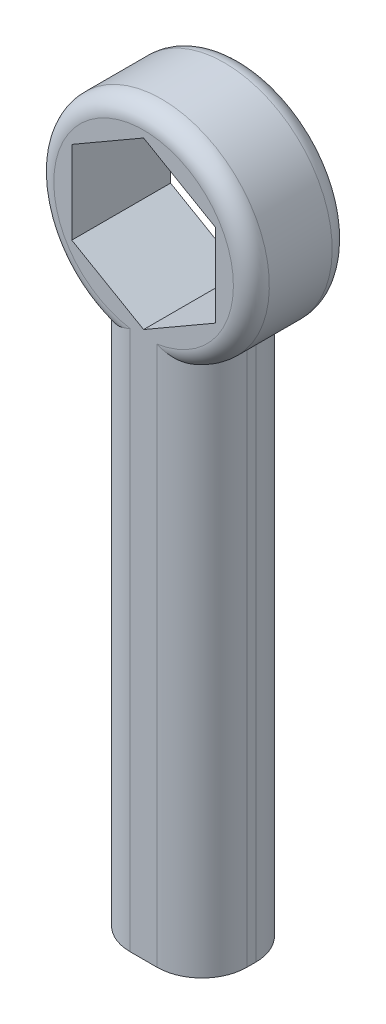
ISO-10303-21;
HEADER;
FILE_DESCRIPTION(('STEP AP214'),'2;1');
FILE_NAME('part.step','',(''),(''),'','','');
FILE_SCHEMA(('AUTOMOTIVE_DESIGN { 1 0 10303 214 1 1 1 1 }'));
ENDSEC;
DATA;
#1=APPLICATION_CONTEXT('core data for automotive mechanical design processes');
#2=APPLICATION_PROTOCOL_DEFINITION('international standard','automotive_design',2000,#1);
#3=PRODUCT_CONTEXT('',#1,'mechanical');
#4=PRODUCT('Part','Part','',(#3));
#5=PRODUCT_RELATED_PRODUCT_CATEGORY('part','',(#4));
#6=PRODUCT_DEFINITION_FORMATION('','',#4);
#7=PRODUCT_DEFINITION_CONTEXT('part definition',#1,'design');
#8=PRODUCT_DEFINITION('design','',#6,#7);
#9=PRODUCT_DEFINITION_SHAPE('','',#8);
#10=(LENGTH_UNIT() NAMED_UNIT(*) SI_UNIT(.MILLI.,.METRE.));
#11=(NAMED_UNIT(*) PLANE_ANGLE_UNIT() SI_UNIT($,.RADIAN.));
#12=(NAMED_UNIT(*) SI_UNIT($,.STERADIAN.) SOLID_ANGLE_UNIT());
#13=UNCERTAINTY_MEASURE_WITH_UNIT(LENGTH_MEASURE(1.E-05),#10,'distance_accuracy_value','');
#14=(GEOMETRIC_REPRESENTATION_CONTEXT(3) GLOBAL_UNCERTAINTY_ASSIGNED_CONTEXT((#13)) GLOBAL_UNIT_ASSIGNED_CONTEXT((#10,
#11,#12)) REPRESENTATION_CONTEXT('',''));
#15=CARTESIAN_POINT('',(0.,0.,0.));
#16=DIRECTION('',(0.,0.,1.));
#17=DIRECTION('',(1.,0.,0.));
#18=AXIS2_PLACEMENT_3D('',#15,#16,#17);
#19=CARTESIAN_POINT('',(1.5,70.,-0.500000000000002));
#20=DIRECTION('',(0.,-1.,0.));
#21=DIRECTION('',(0.,0.,-1.));
#22=AXIS2_PLACEMENT_3D('',#19,#20,#21);
#23=CYLINDRICAL_SURFACE('',#22,5.);
#24=DIRECTION('',(0.,-1.,0.));
#25=VECTOR('',#24,1.);
#26=CARTESIAN_POINT('',(1.49999999999996,70.,-5.5));
#27=LINE('',#26,#25);
#28=CARTESIAN_POINT('',(1.49999999999996,60.1131400333574,-5.5));
#29=VERTEX_POINT('',#28);
#30=CARTESIAN_POINT('',(1.49999999999996,0.,-5.5));
#31=VERTEX_POINT('',#30);
#32=EDGE_CURVE('E377',#29,#31,#27,.T.);
#33=ORIENTED_EDGE('',*,*,#32,.F.);
#34=CARTESIAN_POINT('',(5.49999999999999,59.3346354961492,-3.5));
#35=CARTESIAN_POINT('',(5.45124143479287,59.3094776292966,-3.56503879454095));
#36=CARTESIAN_POINT('',(5.40034241967062,59.2872350126028,-3.62957380392987));
#37=CARTESIAN_POINT('',(5.29457365874422,59.2483664907826,-3.75699543171036));
#38=CARTESIAN_POINT('',(5.23970635725963,59.2317371632558,-3.81988303286578));
#39=CARTESIAN_POINT('',(5.12652343234616,59.2039182242144,-3.94315317655292));
#40=CARTESIAN_POINT('',(5.06822563834152,59.1927028674889,-4.00354630081369));
#41=CARTESIAN_POINT('',(4.94828264473742,59.1753177176033,-4.12166327627799));
#42=CARTESIAN_POINT('',(4.88663693548613,59.1691486949536,-4.17938671858645));
#43=CARTESIAN_POINT('',(4.69167729612288,59.157454647773,-4.35281829027385));
#44=CARTESIAN_POINT('',(4.55322289605756,59.1599016821991,-4.46343359744472));
#45=CARTESIAN_POINT('',(4.26634261393346,59.182711082341,-4.66876521816472));
#46=CARTESIAN_POINT('',(4.11790440031765,59.2030959938528,-4.76346134472014));
#47=CARTESIAN_POINT('',(3.79229541953926,59.2630564875119,-4.94805722214688));
#48=CARTESIAN_POINT('',(3.61405943604584,59.3049673398718,-5.03531585700614));
#49=CARTESIAN_POINT('',(3.25242926067639,59.4049188301471,-5.18695421767217));
#50=CARTESIAN_POINT('',(3.06903021046214,59.462975149827,-5.25131156068039));
#51=CARTESIAN_POINT('',(2.65576398156407,59.6075889661406,-5.37041609541042));
#52=CARTESIAN_POINT('',(2.42537772622433,59.6976435938048,-5.41908246909473));
#53=CARTESIAN_POINT('',(1.96665779195046,59.892407337434,-5.48355541974921));
#54=CARTESIAN_POINT('',(1.73832180113136,59.9970969122397,-5.499405375479));
#55=CARTESIAN_POINT('',(1.50854314969362,60.1089734957554,-5.49999453062573));
#56=CARTESIAN_POINT('',(1.5042710600282,60.1110558554849,-5.5000000033685));
#57=CARTESIAN_POINT('',(1.5,60.1131400333574,-5.5));
#58=B_SPLINE_CURVE_WITH_KNOTS('',3,(#34,#35,#36,#37,#38,#39,#40,#41,#42,#43,#44,#45,#46,#47,#48,
#49,#50,#51,#52,#53,#54,#55,#56,#57),.UNSPECIFIED.,.F.,.F.,(4,2,2,2,2,2,2,2,2,2,2,4),(0.,
0.255162935083431,0.510170016139327,0.763952207698074,1.01777314130476,1.54718859164722,
2.07727040673703,2.6834658634995,3.29025217441575,4.0436742960229,4.79609986043402,
4.81035757711839),.UNSPECIFIED.);
#59=CARTESIAN_POINT('',(5.49999999999999,59.3346354961492,-3.50000000000001));
#60=VERTEX_POINT('',#59);
#61=EDGE_CURVE('E294',#29,#60,#58,.F.);
#62=ORIENTED_EDGE('',*,*,#61,.T.);
#63=CARTESIAN_POINT('',(1.49999999999996,58.0941191002093,-5.5));
#64=CARTESIAN_POINT('',(1.63913954709118,58.1116260933152,-5.50001884113127));
#65=CARTESIAN_POINT('',(1.77793920735278,58.1316132418032,-5.49419290614323));
#66=CARTESIAN_POINT('',(2.05376525015465,58.1762352917903,-5.47116046217421));
#67=CARTESIAN_POINT('',(2.19079252491806,58.2008677491185,-5.45395992616529));
#68=CARTESIAN_POINT('',(2.46152091437614,58.254366807787,-5.4085884561147));
#69=CARTESIAN_POINT('',(2.59523417605695,58.2832139543095,-5.38046699337544));
#70=CARTESIAN_POINT('',(2.85906135295005,58.3447801349958,-5.31367729382303));
#71=CARTESIAN_POINT('',(2.98917488351717,58.3774995809732,-5.27500793468384));
#72=CARTESIAN_POINT('',(3.37243998309789,58.4806119696976,-5.14399131991311));
#73=CARTESIAN_POINT('',(3.61923014235078,58.556103310103,-5.03651281410748));
#74=CARTESIAN_POINT('',(4.0904032120329,58.7159061465054,-4.785015064546));
#75=CARTESIAN_POINT('',(4.31475888741042,58.8002281145916,-4.64095214091062));
#76=CARTESIAN_POINT('',(4.75176467338913,58.9781968990913,-4.30874173692321));
#77=CARTESIAN_POINT('',(4.96251843025431,59.0720845452376,-4.11822673189387));
#78=CARTESIAN_POINT('',(5.34977176737012,59.2563518071146,-3.70309366760325));
#79=CARTESIAN_POINT('',(5.52624707501033,59.3467289010526,-3.47845164210085));
#80=CARTESIAN_POINT('',(5.76443306097233,59.4747967627895,-3.11471317602926));
#81=CARTESIAN_POINT('',(5.84053519128672,59.5169318592724,-2.9863971893481));
#82=CARTESIAN_POINT('',(5.98143922978882,59.5966869126646,-2.72239961434198));
#83=CARTESIAN_POINT('',(6.04624693465054,59.6343091825972,-2.58672185149297));
#84=CARTESIAN_POINT('',(6.16366143495301,59.7036933928653,-2.30912054344047));
#85=CARTESIAN_POINT('',(6.21629623685398,59.7354687501608,-2.16721224713569));
#86=CARTESIAN_POINT('',(6.30875384022736,59.7920345632767,-1.8780169764702));
#87=CARTESIAN_POINT('',(6.34858336546762,59.8168286839379,-1.73073287021806));
#88=CARTESIAN_POINT('',(6.42067156306684,59.8620938157776,-1.40524185690401));
#89=CARTESIAN_POINT('',(6.45030475282544,59.8810001159499,-1.22621303517168));
#90=CARTESIAN_POINT('',(6.48005886110237,59.9000515758258,-0.955322190733073));
#91=CARTESIAN_POINT('',(6.48752772328559,59.9048508839712,-0.864518169750184));
#92=CARTESIAN_POINT('',(6.49750040096449,59.911268304655,-0.682485814282996));
#93=CARTESIAN_POINT('',(6.50000201001901,59.9128850034837,-0.591257309270508));
#94=CARTESIAN_POINT('',(6.5,59.912879499084,-0.499999999999967));
#95=B_SPLINE_CURVE_WITH_KNOTS('',3,(#63,#64,#65,#66,#67,#68,#69,#70,#71,#72,#73,#74,#75,#76,#77,
#78,#79,#80,#81,#82,#83,#84,#85,#86,#87,#88,#89,#90,#91,#92,#93,#94),.UNSPECIFIED.,.F.,.F.,(4,2,
2,2,2,2,2,2,2,2,2,2,2,2,2,4),(0.,0.420524360573177,0.840828072718581,1.25924962907865,
1.67771572405541,2.51245889652881,3.34820343326599,4.24201512453082,5.13645743590923,
5.60098505524376,6.06527355694623,6.5284829908519,6.99144880497591,7.53716078065887,
7.8107064089409,8.08437351833373),.UNSPECIFIED.);
#96=CARTESIAN_POINT('',(6.5,59.912879499084,-0.499999999999967));
#97=VERTEX_POINT('',#96);
#98=EDGE_CURVE('E248',#60,#97,#95,.T.);
#99=ORIENTED_EDGE('',*,*,#98,.T.);
#100=DIRECTION('',(0.,-1.,0.));
#101=VECTOR('',#100,1.);
#102=CARTESIAN_POINT('',(6.5,70.,-0.499999999999967));
#103=LINE('',#102,#101);
#104=CARTESIAN_POINT('',(6.5,0.,-0.499999999999967));
#105=VERTEX_POINT('',#104);
#106=EDGE_CURVE('E358',#97,#105,#103,.T.);
#107=ORIENTED_EDGE('',*,*,#106,.T.);
#108=CARTESIAN_POINT('',(1.5,0.,-0.500000000000002));
#109=DIRECTION('',(0.,1.,0.));
#110=DIRECTION('',(0.,0.,-1.));
#111=AXIS2_PLACEMENT_3D('',#108,#109,#110);
#112=CIRCLE('',#111,5.);
#113=EDGE_CURVE('E328',#105,#31,#112,.T.);
#114=ORIENTED_EDGE('',*,*,#113,.T.);
#115=EDGE_LOOP('',(#33,#62,#99,#107,#114));
#116=FACE_BOUND('',#115,.T.);
#117=ADVANCED_FACE('F42',(#116),#23,.T.);
#118=CARTESIAN_POINT('',(-1.49999999999997,70.,-5.5));
#119=DIRECTION('',(0.,0.,1.));
#120=DIRECTION('',(1.,0.,0.));
#121=AXIS2_PLACEMENT_3D('',#118,#119,#120);
#122=PLANE('',#121);
#123=DIRECTION('',(0.,1.,0.));
#124=VECTOR('',#123,1.);
#125=CARTESIAN_POINT('',(8.00000000000001,65.381197846483,-5.5));
#126=LINE('',#125,#124);
#127=CARTESIAN_POINT('',(8.00000000000001,65.381197846483,-5.5));
#128=VERTEX_POINT('',#127);
#129=CARTESIAN_POINT('',(8.00000000000001,74.618802153517,-5.5));
#130=VERTEX_POINT('',#129);
#131=EDGE_CURVE('E175',#128,#130,#126,.T.);
#132=ORIENTED_EDGE('',*,*,#131,.T.);
#133=DIRECTION('',(-0.866025403784438,0.5,0.));
#134=VECTOR('',#133,1.);
#135=CARTESIAN_POINT('',(8.00000000000001,74.618802153517,-5.5));
#136=LINE('',#135,#134);
#137=CARTESIAN_POINT('',(0.,79.237604307034,-5.5));
#138=VERTEX_POINT('',#137);
#139=EDGE_CURVE('E166',#130,#138,#136,.T.);
#140=ORIENTED_EDGE('',*,*,#139,.T.);
#141=DIRECTION('',(-0.866025403784439,-0.5,0.));
#142=VECTOR('',#141,1.);
#143=CARTESIAN_POINT('',(0.,79.237604307034,-5.5));
#144=LINE('',#143,#142);
#145=CARTESIAN_POINT('',(-8.00000000000001,74.618802153517,-5.5));
#146=VERTEX_POINT('',#145);
#147=EDGE_CURVE('E179',#138,#146,#144,.T.);
#148=ORIENTED_EDGE('',*,*,#147,.T.);
#149=DIRECTION('',(0.,-1.,0.));
#150=VECTOR('',#149,1.);
#151=CARTESIAN_POINT('',(-8.00000000000001,74.618802153517,-5.5));
#152=LINE('',#151,#150);
#153=CARTESIAN_POINT('',(-8.00000000000001,65.381197846483,-5.5));
#154=VERTEX_POINT('',#153);
#155=EDGE_CURVE('E184',#146,#154,#152,.T.);
#156=ORIENTED_EDGE('',*,*,#155,.T.);
#157=DIRECTION('',(0.866025403784438,-0.5,0.));
#158=VECTOR('',#157,1.);
#159=CARTESIAN_POINT('',(-8.00000000000001,65.381197846483,-5.5));
#160=LINE('',#159,#158);
#161=CARTESIAN_POINT('',(0.,60.762395692966,-5.5));
#162=VERTEX_POINT('',#161);
#163=EDGE_CURVE('E200',#154,#162,#160,.T.);
#164=ORIENTED_EDGE('',*,*,#163,.T.);
#165=DIRECTION('',(0.866025403784438,0.5,0.));
#166=VECTOR('',#165,1.);
#167=CARTESIAN_POINT('',(0.,60.762395692966,-5.5));
#168=LINE('',#167,#166);
#169=EDGE_CURVE('E204',#162,#128,#168,.T.);
#170=ORIENTED_EDGE('',*,*,#169,.T.);
#171=EDGE_LOOP('',(#132,#140,#148,#156,#164,#170));
#172=FACE_BOUND('',#171,.T.);
#173=DIRECTION('',(0.,-1.,0.));
#174=VECTOR('',#173,1.);
#175=CARTESIAN_POINT('',(-1.49999999999997,70.,-5.5));
#176=LINE('',#175,#174);
#177=CARTESIAN_POINT('',(-1.49999999999997,60.1131400333574,-5.5));
#178=VERTEX_POINT('',#177);
#179=CARTESIAN_POINT('',(-1.49999999999997,0.,-5.5));
#180=VERTEX_POINT('',#179);
#181=EDGE_CURVE('E374',#178,#180,#176,.T.);
#182=ORIENTED_EDGE('',*,*,#181,.F.);
#183=CARTESIAN_POINT('',(0.,70.,-5.5));
#184=DIRECTION('',(0.,0.,1.));
#185=DIRECTION('',(1.,0.,0.));
#186=AXIS2_PLACEMENT_3D('',#183,#184,#185);
#187=CIRCLE('',#186,10.);
#188=EDGE_CURVE('E390',#178,#29,#187,.F.);
#189=ORIENTED_EDGE('',*,*,#188,.T.);
#190=ORIENTED_EDGE('',*,*,#32,.T.);
#191=DIRECTION('',(-1.,0.,0.));
#192=VECTOR('',#191,1.);
#193=CARTESIAN_POINT('',(-1.49999999999997,0.,-5.5));
#194=LINE('',#193,#192);
#195=EDGE_CURVE('E332',#31,#180,#194,.T.);
#196=ORIENTED_EDGE('',*,*,#195,.T.);
#197=EDGE_LOOP('',(#182,#189,#190,#196));
#198=FACE_BOUND('',#197,.T.);
#199=ADVANCED_FACE('F186',(#172,#198),#122,.F.);
#200=CARTESIAN_POINT('',(-1.5,70.,-0.500000000000003));
#201=DIRECTION('',(0.,-1.,0.));
#202=DIRECTION('',(0.,0.,-1.));
#203=AXIS2_PLACEMENT_3D('',#200,#201,#202);
#204=CYLINDRICAL_SURFACE('',#203,5.);
#205=DIRECTION('',(0.,-1.,0.));
#206=VECTOR('',#205,1.);
#207=CARTESIAN_POINT('',(-6.5,70.,-0.499999999999968));
#208=LINE('',#207,#206);
#209=CARTESIAN_POINT('',(-6.5,59.912879499084,-0.499999999999968));
#210=VERTEX_POINT('',#209);
#211=CARTESIAN_POINT('',(-6.5,0.,-0.499999999999968));
#212=VERTEX_POINT('',#211);
#213=EDGE_CURVE('E371',#210,#212,#208,.T.);
#214=ORIENTED_EDGE('',*,*,#213,.F.);
#215=CARTESIAN_POINT('',(-6.5,59.912879499084,-0.499999999999967));
#216=CARTESIAN_POINT('',(-6.50002491465082,59.9129163868313,-0.628249275897049));
#217=CARTESIAN_POINT('',(-6.49506652337125,59.9097008579164,-0.756476415227092));
#218=CARTESIAN_POINT('',(-6.47537842532044,59.897043889757,-1.01178631332062));
#219=CARTESIAN_POINT('',(-6.46065520126849,59.8876065810791,-1.13886977465874));
#220=CARTESIAN_POINT('',(-6.42175625675369,59.8628631663725,-1.39016398963405));
#221=CARTESIAN_POINT('',(-6.39764120107314,59.8475947374098,-1.51438786687479));
#222=CARTESIAN_POINT('',(-6.34030553389152,59.8116896161126,-1.7599017787075));
#223=CARTESIAN_POINT('',(-6.3070837958205,59.7910522596145,-1.88119144829277));
#224=CARTESIAN_POINT('',(-6.19451443384475,59.7220736142747,-2.23890806687706));
#225=CARTESIAN_POINT('',(-6.10213275321691,59.6665789143262,-2.47000111652735));
#226=CARTESIAN_POINT('',(-5.88604409407034,59.5419897825838,-2.91322573632252));
#227=CARTESIAN_POINT('',(-5.76228523267378,59.4728728687095,-3.12532510618342));
#228=CARTESIAN_POINT('',(-5.47426920449274,59.3200518592679,-3.54562338670021));
#229=CARTESIAN_POINT('',(-5.30735820443295,59.2355934394877,-3.75172665288007));
#230=CARTESIAN_POINT('',(-4.94373358806348,59.0638278359148,-4.13461256345031));
#231=CARTESIAN_POINT('',(-4.74700492595697,58.9765192314878,-4.31138031045761));
#232=CARTESIAN_POINT('',(-4.42058464102996,58.8431904898364,-4.56100895927803));
#233=CARTESIAN_POINT('',(-4.29984607879946,58.7960281373658,-4.64518912147816));
#234=CARTESIAN_POINT('',(-4.05089989533878,58.7036376051632,-4.80285902786553));
#235=CARTESIAN_POINT('',(-3.92269496358246,58.6584087390229,-4.876352588541));
#236=CARTESIAN_POINT('',(-3.65961399565598,58.5708075492567,-5.01197934758483));
#237=CARTESIAN_POINT('',(-3.52474301690141,58.5284331159909,-5.07412099533232));
#238=CARTESIAN_POINT('',(-3.24912094570029,58.4473455717078,-5.18643788679743));
#239=CARTESIAN_POINT('',(-3.1083732885905,58.4086303636463,-5.2366200097288));
#240=CARTESIAN_POINT('',(-2.84813645764704,58.342268174812,-5.31637948732618));
#241=CARTESIAN_POINT('',(-2.72946937295365,58.3138921286289,-5.3480468835205));
#242=CARTESIAN_POINT('',(-2.48943941908953,58.2604170380037,-5.40266815558527));
#243=CARTESIAN_POINT('',(-2.36807713559672,58.2353172896063,-5.42562390529554));
#244=CARTESIAN_POINT('',(-2.12299082504192,58.188629000413,-5.46258707480236));
#245=CARTESIAN_POINT('',(-1.999261462247,58.1670497912986,-5.47657099192571));
#246=CARTESIAN_POINT('',(-1.7504447940108,58.1276827962383,-5.49528643638811));
#247=CARTESIAN_POINT('',(-1.62535683658251,58.1098969236,-5.50001330438518));
#248=CARTESIAN_POINT('',(-1.49999999999996,58.0941191002093,-5.5));
#249=B_SPLINE_CURVE_WITH_KNOTS('',3,(#215,#216,#217,#218,#219,#220,#221,#222,#223,#224,#225,
#226,#227,#228,#229,#230,#231,#232,#233,#234,#235,#236,#237,#238,#239,#240,#241,#242,#243,#244,
#245,#246,#247,#248),.UNSPECIFIED.,.F.,.F.,(4,2,2,2,2,2,2,2,2,2,2,2,2,2,2,2,4),(0.,
0.384575527828777,0.768895997223525,1.15077412777258,1.53269952105824,2.29408222994681,
3.05673220803316,3.88850123849028,4.72069138008232,5.18389051630782,5.64692382255978,
6.10961107013372,6.57203153047936,6.94984596442557,7.32757908589612,7.7062977223862,
8.08520693003577),.UNSPECIFIED.);
#250=CARTESIAN_POINT('',(-5.5,59.3346354961492,-3.5));
#251=VERTEX_POINT('',#250);
#252=EDGE_CURVE('E320',#210,#251,#249,.T.);
#253=ORIENTED_EDGE('',*,*,#252,.T.);
#254=CARTESIAN_POINT('',(-5.5,59.3346354961492,-3.5));
#255=CARTESIAN_POINT('',(-5.45124143479289,59.3094776292966,-3.56503879454094));
#256=CARTESIAN_POINT('',(-5.40034241967064,59.2872350126028,-3.62957380392985));
#257=CARTESIAN_POINT('',(-5.29457365874426,59.2483664907826,-3.75699543171033));
#258=CARTESIAN_POINT('',(-5.23970635725967,59.2317371632559,-3.81988303286573));
#259=CARTESIAN_POINT('',(-5.1265234323462,59.2039182242144,-3.94315317655288));
#260=CARTESIAN_POINT('',(-5.06822563834155,59.1927028674889,-4.00354630081366));
#261=CARTESIAN_POINT('',(-4.94828264473744,59.1753177176033,-4.12166327627797));
#262=CARTESIAN_POINT('',(-4.88663693548615,59.1691486949536,-4.17938671858644));
#263=CARTESIAN_POINT('',(-4.69167729612288,59.157454647773,-4.35281829027385));
#264=CARTESIAN_POINT('',(-4.55322289605755,59.1599016821991,-4.46343359744474));
#265=CARTESIAN_POINT('',(-4.26634261393344,59.182711082341,-4.66876521816474));
#266=CARTESIAN_POINT('',(-4.11790440031764,59.2030959938528,-4.76346134472015));
#267=CARTESIAN_POINT('',(-3.79229541953929,59.2630564875119,-4.94805722214686));
#268=CARTESIAN_POINT('',(-3.61405943604592,59.3049673398718,-5.03531585700611));
#269=CARTESIAN_POINT('',(-3.25242926067643,59.4049188301471,-5.18695421767215));
#270=CARTESIAN_POINT('',(-3.0690302104621,59.4629751498268,-5.25131156068038));
#271=CARTESIAN_POINT('',(-2.65576398156412,59.6075889661408,-5.37041609541043));
#272=CARTESIAN_POINT('',(-2.42537772622462,59.6976435938056,-5.41908246909475));
#273=CARTESIAN_POINT('',(-1.96665779195002,59.8924073374333,-5.48355541974921));
#274=CARTESIAN_POINT('',(-1.73832180112996,59.9970969122369,-5.499405375479));
#275=CARTESIAN_POINT('',(-1.50854314969359,60.1089734957553,-5.49999453062573));
#276=CARTESIAN_POINT('',(-1.50427106002818,60.1110558554849,-5.5000000033685));
#277=CARTESIAN_POINT('',(-1.5,60.1131400333574,-5.5));
#278=B_SPLINE_CURVE_WITH_KNOTS('',3,(#254,#255,#256,#257,#258,#259,#260,#261,#262,#263,#264,
#265,#266,#267,#268,#269,#270,#271,#272,#273,#274,#275,#276,#277),.UNSPECIFIED.,.F.,.F.,(4,2,2,
2,2,2,2,2,2,2,2,4),(0.,0.255162935083397,0.510170016139262,0.76395220769804,1.01777314130476,
1.54718859164727,2.07727040673704,2.68346586349941,3.29025217441576,4.04367429602305,
4.796099860434,4.8103575771184),.UNSPECIFIED.);
#279=EDGE_CURVE('E301',#251,#178,#278,.T.);
#280=ORIENTED_EDGE('',*,*,#279,.T.);
#281=ORIENTED_EDGE('',*,*,#181,.T.);
#282=CARTESIAN_POINT('',(-1.5,0.,-0.500000000000003));
#283=DIRECTION('',(0.,1.,0.));
#284=DIRECTION('',(0.,0.,1.));
#285=AXIS2_PLACEMENT_3D('',#282,#283,#284);
#286=CIRCLE('',#285,5.);
#287=EDGE_CURVE('E336',#180,#212,#286,.T.);
#288=ORIENTED_EDGE('',*,*,#287,.T.);
#289=EDGE_LOOP('',(#214,#253,#280,#281,#288));
#290=FACE_BOUND('',#289,.T.);
#291=ADVANCED_FACE('F315',(#290),#204,.T.);
#292=CARTESIAN_POINT('',(-6.5,70.,-0.499999999999967));
#293=DIRECTION('',(1.,0.,0.));
#294=DIRECTION('',(0.,0.,-1.));
#295=AXIS2_PLACEMENT_3D('',#292,#293,#294);
#296=PLANE('',#295);
#297=DIRECTION('',(0.,-1.,0.));
#298=VECTOR('',#297,1.);
#299=CARTESIAN_POINT('',(-6.5,70.,0.499999999999962));
#300=LINE('',#299,#298);
#301=CARTESIAN_POINT('',(-6.5,59.912879499084,0.499999999999962));
#302=VERTEX_POINT('',#301);
#303=CARTESIAN_POINT('',(-6.5,0.,0.499999999999962));
#304=VERTEX_POINT('',#303);
#305=EDGE_CURVE('E368',#302,#304,#300,.T.);
#306=ORIENTED_EDGE('',*,*,#305,.F.);
#307=DIRECTION('',(0.,0.,1.));
#308=VECTOR('',#307,1.);
#309=CARTESIAN_POINT('',(-6.5,59.912879499084,-5.5));
#310=LINE('',#309,#308);
#311=EDGE_CURVE('E279',#302,#210,#310,.F.);
#312=ORIENTED_EDGE('',*,*,#311,.T.);
#313=ORIENTED_EDGE('',*,*,#213,.T.);
#314=DIRECTION('',(0.,0.,1.));
#315=VECTOR('',#314,1.);
#316=CARTESIAN_POINT('',(-6.5,0.,-0.499999999999967));
#317=LINE('',#316,#315);
#318=EDGE_CURVE('E340',#212,#304,#317,.T.);
#319=ORIENTED_EDGE('',*,*,#318,.T.);
#320=EDGE_LOOP('',(#306,#312,#313,#319));
#321=FACE_BOUND('',#320,.T.);
#322=ADVANCED_FACE('F285',(#321),#296,.F.);
#323=CARTESIAN_POINT('',(-1.5,70.,0.499999999999997));
#324=DIRECTION('',(0.,-1.,0.));
#325=DIRECTION('',(0.,0.,-1.));
#326=AXIS2_PLACEMENT_3D('',#323,#324,#325);
#327=CYLINDRICAL_SURFACE('',#326,5.);
#328=DIRECTION('',(0.,-1.,0.));
#329=VECTOR('',#328,1.);
#330=CARTESIAN_POINT('',(-1.49999999999997,70.,5.5));
#331=LINE('',#330,#329);
#332=CARTESIAN_POINT('',(-1.49999999999997,60.1131400333574,5.5));
#333=VERTEX_POINT('',#332);
#334=CARTESIAN_POINT('',(-1.49999999999997,0.,5.5));
#335=VERTEX_POINT('',#334);
#336=EDGE_CURVE('E64',#333,#335,#331,.T.);
#337=ORIENTED_EDGE('',*,*,#336,.F.);
#338=CARTESIAN_POINT('',(-5.49999999999999,59.3346354961492,3.5));
#339=CARTESIAN_POINT('',(-5.45124143479288,59.3094776292966,3.56503879454094));
#340=CARTESIAN_POINT('',(-5.40034241967063,59.2872350126028,3.62957380392985));
#341=CARTESIAN_POINT('',(-5.29457365874425,59.2483664907826,3.75699543171032));
#342=CARTESIAN_POINT('',(-5.23970635725966,59.2317371632559,3.81988303286573));
#343=CARTESIAN_POINT('',(-5.1265234323462,59.2039182242144,3.94315317655288));
#344=CARTESIAN_POINT('',(-5.06822563834155,59.1927028674889,4.00354630081365));
#345=CARTESIAN_POINT('',(-4.94828264473744,59.1753177176033,4.12166327627797));
#346=CARTESIAN_POINT('',(-4.88663693548615,59.1691486949536,4.17938671858644));
#347=CARTESIAN_POINT('',(-4.69167729612288,59.157454647773,4.35281829027385));
#348=CARTESIAN_POINT('',(-4.55322289605754,59.1599016821991,4.46343359744473));
#349=CARTESIAN_POINT('',(-4.26634261393344,59.182711082341,4.66876521816473));
#350=CARTESIAN_POINT('',(-4.11790440031763,59.2030959938528,4.76346134472014));
#351=CARTESIAN_POINT('',(-3.79229541953929,59.2630564875119,4.94805722214686));
#352=CARTESIAN_POINT('',(-3.61405943604592,59.3049673398718,5.0353158570061));
#353=CARTESIAN_POINT('',(-3.25242926067643,59.4049188301471,5.18695421767215));
#354=CARTESIAN_POINT('',(-3.0690302104621,59.4629751498268,5.25131156068038));
#355=CARTESIAN_POINT('',(-2.65576398156411,59.6075889661408,5.37041609541043));
#356=CARTESIAN_POINT('',(-2.42537772622462,59.6976435938057,5.41908246909475));
#357=CARTESIAN_POINT('',(-1.96665779194997,59.8924073374332,5.48355541974921));
#358=CARTESIAN_POINT('',(-1.73832180112986,59.9970969122367,5.49940537547899));
#359=CARTESIAN_POINT('',(-1.50854314969357,60.1089734957553,5.49999453062572));
#360=CARTESIAN_POINT('',(-1.50427106002817,60.1110558554849,5.5000000033685));
#361=CARTESIAN_POINT('',(-1.5,60.1131400333574,5.5));
#362=B_SPLINE_CURVE_WITH_KNOTS('',3,(#338,#339,#340,#341,#342,#343,#344,#345,#346,#347,#348,
#349,#350,#351,#352,#353,#354,#355,#356,#357,#358,#359,#360,#361),.UNSPECIFIED.,.F.,.F.,(4,2,2,
2,2,2,2,2,2,2,2,4),(0.,0.255162935083394,0.510170016139259,0.763952207698039,1.01777314130476,
1.54718859164727,2.07727040673704,2.6834658634994,3.29025217441575,4.04367429602306,
4.79609986043404,4.81035757711839),.UNSPECIFIED.);
#363=CARTESIAN_POINT('',(-5.5,59.3346354961492,3.5));
#364=VERTEX_POINT('',#363);
#365=EDGE_CURVE('E57',#333,#364,#362,.F.);
#366=ORIENTED_EDGE('',*,*,#365,.T.);
#367=CARTESIAN_POINT('',(-1.49999999999997,58.0941191002093,5.5));
#368=CARTESIAN_POINT('',(-1.63913954709118,58.1116260933152,5.50001884113126));
#369=CARTESIAN_POINT('',(-1.77793920735279,58.1316132418032,5.49419290614322));
#370=CARTESIAN_POINT('',(-2.05376525015466,58.1762352917903,5.47116046217421));
#371=CARTESIAN_POINT('',(-2.19079252491806,58.2008677491185,5.45395992616528));
#372=CARTESIAN_POINT('',(-2.46152091437614,58.254366807787,5.40858845611469));
#373=CARTESIAN_POINT('',(-2.59523417605695,58.2832139543095,5.38046699337544));
#374=CARTESIAN_POINT('',(-2.85906135295006,58.3447801349958,5.31367729382302));
#375=CARTESIAN_POINT('',(-2.98917488351717,58.3774995809732,5.27500793468383));
#376=CARTESIAN_POINT('',(-3.37243998309789,58.4806119696976,5.14399131991311));
#377=CARTESIAN_POINT('',(-3.61923014235078,58.556103310103,5.03651281410747));
#378=CARTESIAN_POINT('',(-4.0904032120329,58.7159061465054,4.785015064546));
#379=CARTESIAN_POINT('',(-4.31475888741042,58.8002281145916,4.64095214091061));
#380=CARTESIAN_POINT('',(-4.75176467338913,58.9781968990913,4.3087417369232));
#381=CARTESIAN_POINT('',(-4.96251843025431,59.0720845452376,4.11822673189387));
#382=CARTESIAN_POINT('',(-5.34977176737012,59.2563518071146,3.70309366760324));
#383=CARTESIAN_POINT('',(-5.52624707501033,59.3467289010526,3.47845164210084));
#384=CARTESIAN_POINT('',(-5.76443306097233,59.4747967627895,3.11471317602926));
#385=CARTESIAN_POINT('',(-5.84053519128673,59.5169318592724,2.9863971893481));
#386=CARTESIAN_POINT('',(-5.98143922978882,59.5966869126646,2.72239961434197));
#387=CARTESIAN_POINT('',(-6.04624693465055,59.6343091825972,2.58672185149296));
#388=CARTESIAN_POINT('',(-6.16366143495301,59.7036933928653,2.30912054344047));
#389=CARTESIAN_POINT('',(-6.21629623685398,59.7354687501608,2.16721224713568));
#390=CARTESIAN_POINT('',(-6.30875384022736,59.7920345632767,1.87801697647019));
#391=CARTESIAN_POINT('',(-6.34858336546762,59.8168286839379,1.73073287021805));
#392=CARTESIAN_POINT('',(-6.42067156306684,59.8620938157776,1.405241856904));
#393=CARTESIAN_POINT('',(-6.45030475282544,59.8810001159499,1.22621303517167));
#394=CARTESIAN_POINT('',(-6.48005886110237,59.9000515758258,0.955322190733067));
#395=CARTESIAN_POINT('',(-6.4875277232856,59.9048508839712,0.864518169750178));
#396=CARTESIAN_POINT('',(-6.49750040096449,59.911268304655,0.68248581428299));
#397=CARTESIAN_POINT('',(-6.50000201001902,59.9128850034837,0.591257309270503));
#398=CARTESIAN_POINT('',(-6.5,59.912879499084,0.499999999999962));
#399=B_SPLINE_CURVE_WITH_KNOTS('',3,(#367,#368,#369,#370,#371,#372,#373,#374,#375,#376,#377,
#378,#379,#380,#381,#382,#383,#384,#385,#386,#387,#388,#389,#390,#391,#392,#393,#394,#395,#396,
#397,#398),.UNSPECIFIED.,.F.,.F.,(4,2,2,2,2,2,2,2,2,2,2,2,2,2,2,4),(0.,0.420524360573177,
0.840828072718581,1.25924962907865,1.67771572405541,2.5124588965288,3.34820343326599,
4.24201512453082,5.13645743590922,5.60098505524376,6.06527355694623,6.5284829908519,
6.99144880497592,7.53716078065888,7.8107064089409,8.08437351833373),.UNSPECIFIED.);
#400=EDGE_CURVE('E271',#364,#302,#399,.T.);
#401=ORIENTED_EDGE('',*,*,#400,.T.);
#402=ORIENTED_EDGE('',*,*,#305,.T.);
#403=CARTESIAN_POINT('',(-1.5,0.,0.499999999999997));
#404=DIRECTION('',(0.,1.,0.));
#405=DIRECTION('',(0.,0.,-1.));
#406=AXIS2_PLACEMENT_3D('',#403,#404,#405);
#407=CIRCLE('',#406,5.);
#408=EDGE_CURVE('E344',#304,#335,#407,.T.);
#409=ORIENTED_EDGE('',*,*,#408,.T.);
#410=EDGE_LOOP('',(#337,#366,#401,#402,#409));
#411=FACE_BOUND('',#410,.T.);
#412=ADVANCED_FACE('F280',(#411),#327,.T.);
#413=CARTESIAN_POINT('',(-1.49999999999997,70.,5.5));
#414=DIRECTION('',(0.,0.,-1.));
#415=DIRECTION('',(-1.,0.,0.));
#416=AXIS2_PLACEMENT_3D('',#413,#414,#415);
#417=PLANE('',#416);
#418=DIRECTION('',(-0.866025403784439,-0.5,0.));
#419=VECTOR('',#418,1.);
#420=CARTESIAN_POINT('',(0.,79.237604307034,5.5));
#421=LINE('',#420,#419);
#422=CARTESIAN_POINT('',(0.,79.237604307034,5.5));
#423=VERTEX_POINT('',#422);
#424=CARTESIAN_POINT('',(-8.00000000000001,74.618802153517,5.5));
#425=VERTEX_POINT('',#424);
#426=EDGE_CURVE('E211',#423,#425,#421,.T.);
#427=ORIENTED_EDGE('',*,*,#426,.F.);
#428=DIRECTION('',(-0.866025403784438,0.5,0.));
#429=VECTOR('',#428,1.);
#430=CARTESIAN_POINT('',(8.00000000000001,74.618802153517,5.5));
#431=LINE('',#430,#429);
#432=CARTESIAN_POINT('',(8.00000000000001,74.618802153517,5.5));
#433=VERTEX_POINT('',#432);
#434=EDGE_CURVE('E169',#433,#423,#431,.T.);
#435=ORIENTED_EDGE('',*,*,#434,.F.);
#436=DIRECTION('',(0.,1.,0.));
#437=VECTOR('',#436,1.);
#438=CARTESIAN_POINT('',(8.00000000000001,65.381197846483,5.5));
#439=LINE('',#438,#437);
#440=CARTESIAN_POINT('',(8.00000000000001,65.381197846483,5.5));
#441=VERTEX_POINT('',#440);
#442=EDGE_CURVE('E191',#441,#433,#439,.T.);
#443=ORIENTED_EDGE('',*,*,#442,.F.);
#444=DIRECTION('',(0.866025403784438,0.5,0.));
#445=VECTOR('',#444,1.);
#446=CARTESIAN_POINT('',(0.,60.762395692966,5.5));
#447=LINE('',#446,#445);
#448=CARTESIAN_POINT('',(0.,60.762395692966,5.5));
#449=VERTEX_POINT('',#448);
#450=EDGE_CURVE('E195',#449,#441,#447,.T.);
#451=ORIENTED_EDGE('',*,*,#450,.F.);
#452=DIRECTION('',(0.866025403784438,-0.5,0.));
#453=VECTOR('',#452,1.);
#454=CARTESIAN_POINT('',(-8.00000000000001,65.381197846483,5.5));
#455=LINE('',#454,#453);
#456=CARTESIAN_POINT('',(-8.00000000000001,65.381197846483,5.5));
#457=VERTEX_POINT('',#456);
#458=EDGE_CURVE('E218',#457,#449,#455,.T.);
#459=ORIENTED_EDGE('',*,*,#458,.F.);
#460=DIRECTION('',(0.,-1.,0.));
#461=VECTOR('',#460,1.);
#462=CARTESIAN_POINT('',(-8.00000000000001,74.618802153517,5.5));
#463=LINE('',#462,#461);
#464=EDGE_CURVE('E214',#425,#457,#463,.T.);
#465=ORIENTED_EDGE('',*,*,#464,.F.);
#466=EDGE_LOOP('',(#427,#435,#443,#451,#459,#465));
#467=FACE_BOUND('',#466,.T.);
#468=CARTESIAN_POINT('',(0.,70.,5.5));
#469=DIRECTION('',(0.,0.,-1.));
#470=DIRECTION('',(-1.,0.,0.));
#471=AXIS2_PLACEMENT_3D('',#468,#469,#470);
#472=CIRCLE('',#471,10.);
#473=CARTESIAN_POINT('',(1.49999999999996,60.1131400333574,5.5));
#474=VERTEX_POINT('',#473);
#475=EDGE_CURVE('E393',#474,#333,#472,.F.);
#476=ORIENTED_EDGE('',*,*,#475,.T.);
#477=ORIENTED_EDGE('',*,*,#336,.T.);
#478=DIRECTION('',(1.,0.,0.));
#479=VECTOR('',#478,1.);
#480=CARTESIAN_POINT('',(-1.49999999999997,0.,5.5));
#481=LINE('',#480,#479);
#482=CARTESIAN_POINT('',(1.49999999999996,0.,5.5));
#483=VERTEX_POINT('',#482);
#484=EDGE_CURVE('E347',#335,#483,#481,.T.);
#485=ORIENTED_EDGE('',*,*,#484,.T.);
#486=DIRECTION('',(0.,-1.,0.));
#487=VECTOR('',#486,1.);
#488=CARTESIAN_POINT('',(1.49999999999996,70.,5.5));
#489=LINE('',#488,#487);
#490=EDGE_CURVE('E72',#474,#483,#489,.T.);
#491=ORIENTED_EDGE('',*,*,#490,.F.);
#492=EDGE_LOOP('',(#476,#477,#485,#491));
#493=FACE_BOUND('',#492,.T.);
#494=ADVANCED_FACE('F284',(#467,#493),#417,.F.);
#495=CARTESIAN_POINT('',(1.5,70.,0.499999999999998));
#496=DIRECTION('',(0.,-1.,0.));
#497=DIRECTION('',(0.,0.,-1.));
#498=AXIS2_PLACEMENT_3D('',#495,#496,#497);
#499=CYLINDRICAL_SURFACE('',#498,5.);
#500=DIRECTION('',(0.,-1.,0.));
#501=VECTOR('',#500,1.);
#502=CARTESIAN_POINT('',(6.5,70.,0.499999999999961));
#503=LINE('',#502,#501);
#504=CARTESIAN_POINT('',(6.5,59.912879499084,0.499999999999961));
#505=VERTEX_POINT('',#504);
#506=CARTESIAN_POINT('',(6.5,0.,0.499999999999961));
#507=VERTEX_POINT('',#506);
#508=EDGE_CURVE('E361',#505,#507,#503,.T.);
#509=ORIENTED_EDGE('',*,*,#508,.F.);
#510=CARTESIAN_POINT('',(6.5,59.912879499084,0.499999999999961));
#511=CARTESIAN_POINT('',(6.50002491465082,59.9129163868313,0.628249275897044));
#512=CARTESIAN_POINT('',(6.49506652337124,59.9097008579164,0.756476415227087));
#513=CARTESIAN_POINT('',(6.47537842532043,59.897043889757,1.01178631332062));
#514=CARTESIAN_POINT('',(6.46065520126848,59.8876065810791,1.13886977465874));
#515=CARTESIAN_POINT('',(6.42175625675369,59.8628631663725,1.39016398963404));
#516=CARTESIAN_POINT('',(6.39764120107314,59.8475947374098,1.51438786687479));
#517=CARTESIAN_POINT('',(6.34030553389152,59.8116896161126,1.75990177870749));
#518=CARTESIAN_POINT('',(6.3070837958205,59.7910522596145,1.88119144829276));
#519=CARTESIAN_POINT('',(6.19451443384474,59.7220736142747,2.23890806687706));
#520=CARTESIAN_POINT('',(6.10213275321691,59.6665789143262,2.47000111652735));
#521=CARTESIAN_POINT('',(5.88604409407034,59.5419897825838,2.91322573632252));
#522=CARTESIAN_POINT('',(5.76228523267377,59.4728728687095,3.12532510618342));
#523=CARTESIAN_POINT('',(5.47426920449274,59.3200518592679,3.5456233867002));
#524=CARTESIAN_POINT('',(5.30735820443294,59.2355934394877,3.75172665288006));
#525=CARTESIAN_POINT('',(4.94373358806347,59.0638278359148,4.13461256345031));
#526=CARTESIAN_POINT('',(4.74700492595697,58.9765192314878,4.3113803104576));
#527=CARTESIAN_POINT('',(4.42058464102996,58.8431904898364,4.56100895927802));
#528=CARTESIAN_POINT('',(4.29984607879946,58.7960281373658,4.64518912147816));
#529=CARTESIAN_POINT('',(4.05089989533878,58.7036376051632,4.80285902786552));
#530=CARTESIAN_POINT('',(3.92269496358246,58.6584087390229,4.87635258854099));
#531=CARTESIAN_POINT('',(3.65961399565598,58.5708075492567,5.01197934758483));
#532=CARTESIAN_POINT('',(3.5247430169014,58.5284331159909,5.07412099533232));
#533=CARTESIAN_POINT('',(3.24912094570028,58.4473455717078,5.18643788679742));
#534=CARTESIAN_POINT('',(3.1083732885905,58.4086303636463,5.2366200097288));
#535=CARTESIAN_POINT('',(2.84813645764703,58.342268174812,5.31637948732617));
#536=CARTESIAN_POINT('',(2.72946937295365,58.3138921286289,5.34804688352049));
#537=CARTESIAN_POINT('',(2.48943941908953,58.2604170380037,5.40266815558526));
#538=CARTESIAN_POINT('',(2.36807713559671,58.2353172896063,5.42562390529553));
#539=CARTESIAN_POINT('',(2.12299082504191,58.188629000413,5.46258707480235));
#540=CARTESIAN_POINT('',(1.999261462247,58.1670497912986,5.4765709919257));
#541=CARTESIAN_POINT('',(1.7504447940108,58.1276827962383,5.4952864363881));
#542=CARTESIAN_POINT('',(1.62535683658251,58.1098969236,5.50001330438518));
#543=CARTESIAN_POINT('',(1.49999999999996,58.0941191002093,5.5));
#544=B_SPLINE_CURVE_WITH_KNOTS('',3,(#510,#511,#512,#513,#514,#515,#516,#517,#518,#519,#520,
#521,#522,#523,#524,#525,#526,#527,#528,#529,#530,#531,#532,#533,#534,#535,#536,#537,#538,#539,
#540,#541,#542,#543),.UNSPECIFIED.,.F.,.F.,(4,2,2,2,2,2,2,2,2,2,2,2,2,2,2,2,4),(0.,
0.384575527828777,0.768895997223526,1.15077412777258,1.53269952105824,2.29408222994681,
3.05673220803316,3.88850123849028,4.72069138008232,5.18389051630782,5.64692382255978,
6.10961107013373,6.57203153047936,6.94984596442557,7.32757908589612,7.7062977223862,
8.08520693003578),.UNSPECIFIED.);
#545=CARTESIAN_POINT('',(5.5,59.3346354961492,3.5));
#546=VERTEX_POINT('',#545);
#547=EDGE_CURVE('E228',#505,#546,#544,.T.);
#548=ORIENTED_EDGE('',*,*,#547,.T.);
#549=CARTESIAN_POINT('',(5.5,59.3346354961492,3.5));
#550=CARTESIAN_POINT('',(5.45124143479289,59.3094776292966,3.56503879454094));
#551=CARTESIAN_POINT('',(5.40034241967064,59.2872350126028,3.62957380392984));
#552=CARTESIAN_POINT('',(5.29457365874426,59.2483664907826,3.75699543171032));
#553=CARTESIAN_POINT('',(5.23970635725967,59.2317371632559,3.81988303286573));
#554=CARTESIAN_POINT('',(5.1265234323462,59.2039182242144,3.94315317655287));
#555=CARTESIAN_POINT('',(5.06822563834155,59.1927028674889,4.00354630081365));
#556=CARTESIAN_POINT('',(4.94828264473744,59.1753177176033,4.12166327627797));
#557=CARTESIAN_POINT('',(4.88663693548615,59.1691486949536,4.17938671858643));
#558=CARTESIAN_POINT('',(4.69167729612288,59.157454647773,4.35281829027385));
#559=CARTESIAN_POINT('',(4.55322289605755,59.1599016821991,4.46343359744473));
#560=CARTESIAN_POINT('',(4.26634261393344,59.182711082341,4.66876521816473));
#561=CARTESIAN_POINT('',(4.11790440031764,59.2030959938528,4.76346134472014));
#562=CARTESIAN_POINT('',(3.79229541953929,59.2630564875119,4.94805722214686));
#563=CARTESIAN_POINT('',(3.61405943604592,59.3049673398718,5.03531585700611));
#564=CARTESIAN_POINT('',(3.25242926067643,59.4049188301471,5.18695421767215));
#565=CARTESIAN_POINT('',(3.0690302104621,59.4629751498268,5.25131156068038));
#566=CARTESIAN_POINT('',(2.65576398156412,59.6075889661408,5.37041609541043));
#567=CARTESIAN_POINT('',(2.42537772622462,59.6976435938056,5.41908246909474));
#568=CARTESIAN_POINT('',(1.96665779195001,59.8924073374333,5.48355541974921));
#569=CARTESIAN_POINT('',(1.73832180112996,59.9970969122369,5.49940537547899));
#570=CARTESIAN_POINT('',(1.50854314969359,60.1089734957553,5.49999453062572));
#571=CARTESIAN_POINT('',(1.50427106002818,60.1110558554849,5.5000000033685));
#572=CARTESIAN_POINT('',(1.5,60.1131400333574,5.5));
#573=B_SPLINE_CURVE_WITH_KNOTS('',3,(#549,#550,#551,#552,#553,#554,#555,#556,#557,#558,#559,
#560,#561,#562,#563,#564,#565,#566,#567,#568,#569,#570,#571,#572),.UNSPECIFIED.,.F.,.F.,(4,2,2,
2,2,2,2,2,2,2,2,4),(0.,0.255162935083396,0.510170016139259,0.763952207698039,1.01777314130476,
1.54718859164727,2.07727040673704,2.68346586349941,3.29025217441576,4.04367429602305,
4.79609986043401,4.8103575771184),.UNSPECIFIED.);
#574=EDGE_CURVE('E11',#546,#474,#573,.T.);
#575=ORIENTED_EDGE('',*,*,#574,.T.);
#576=ORIENTED_EDGE('',*,*,#490,.T.);
#577=CARTESIAN_POINT('',(1.5,0.,0.499999999999998));
#578=DIRECTION('',(0.,1.,0.));
#579=DIRECTION('',(0.,0.,-1.));
#580=AXIS2_PLACEMENT_3D('',#577,#578,#579);
#581=CIRCLE('',#580,5.);
#582=EDGE_CURVE('E350',#483,#507,#581,.T.);
#583=ORIENTED_EDGE('',*,*,#582,.T.);
#584=EDGE_LOOP('',(#509,#548,#575,#576,#583));
#585=FACE_BOUND('',#584,.T.);
#586=ADVANCED_FACE('F255',(#585),#499,.T.);
#587=CARTESIAN_POINT('',(6.5,70.,-0.499999999999967));
#588=DIRECTION('',(-1.,0.,0.));
#589=DIRECTION('',(0.,0.,1.));
#590=AXIS2_PLACEMENT_3D('',#587,#588,#589);
#591=PLANE('',#590);
#592=ORIENTED_EDGE('',*,*,#106,.F.);
#593=DIRECTION('',(0.,0.,1.));
#594=VECTOR('',#593,1.);
#595=CARTESIAN_POINT('',(6.5,59.912879499084,-5.5));
#596=LINE('',#595,#594);
#597=EDGE_CURVE('E380',#97,#505,#596,.T.);
#598=ORIENTED_EDGE('',*,*,#597,.T.);
#599=ORIENTED_EDGE('',*,*,#508,.T.);
#600=DIRECTION('',(0.,0.,-1.));
#601=VECTOR('',#600,1.);
#602=CARTESIAN_POINT('',(6.5,0.,-0.499999999999967));
#603=LINE('',#602,#601);
#604=EDGE_CURVE('E354',#507,#105,#603,.T.);
#605=ORIENTED_EDGE('',*,*,#604,.T.);
#606=EDGE_LOOP('',(#592,#598,#599,#605));
#607=FACE_BOUND('',#606,.T.);
#608=ADVANCED_FACE('F429',(#607),#591,.F.);
#609=CARTESIAN_POINT('',(1.5,0.,-0.500000000000002));
#610=DIRECTION('',(0.,-1.,0.));
#611=DIRECTION('',(0.,0.,-1.));
#612=AXIS2_PLACEMENT_3D('',#609,#610,#611);
#613=PLANE('',#612);
#614=ORIENTED_EDGE('',*,*,#113,.F.);
#615=ORIENTED_EDGE('',*,*,#604,.F.);
#616=ORIENTED_EDGE('',*,*,#582,.F.);
#617=ORIENTED_EDGE('',*,*,#484,.F.);
#618=ORIENTED_EDGE('',*,*,#408,.F.);
#619=ORIENTED_EDGE('',*,*,#318,.F.);
#620=ORIENTED_EDGE('',*,*,#287,.F.);
#621=ORIENTED_EDGE('',*,*,#195,.F.);
#622=EDGE_LOOP('',(#614,#615,#616,#617,#618,#619,#620,#621));
#623=FACE_BOUND('',#622,.T.);
#624=ADVANCED_FACE('F264',(#623),#613,.T.);
#625=CARTESIAN_POINT('',(0.,70.,-5.5));
#626=DIRECTION('',(0.,0.,1.));
#627=DIRECTION('',(1.,0.,0.));
#628=AXIS2_PLACEMENT_3D('',#625,#626,#627);
#629=CYLINDRICAL_SURFACE('',#628,12.);
#630=ORIENTED_EDGE('',*,*,#98,.F.);
#631=CARTESIAN_POINT('',(0.,70.,-3.5));
#632=DIRECTION('',(0.,0.,1.));
#633=DIRECTION('',(1.,0.,0.));
#634=AXIS2_PLACEMENT_3D('',#631,#632,#633);
#635=CIRCLE('',#634,12.);
#636=EDGE_CURVE('E386',#60,#251,#635,.T.);
#637=ORIENTED_EDGE('',*,*,#636,.T.);
#638=ORIENTED_EDGE('',*,*,#252,.F.);
#639=ORIENTED_EDGE('',*,*,#311,.F.);
#640=ORIENTED_EDGE('',*,*,#400,.F.);
#641=CARTESIAN_POINT('',(0.,70.,3.5));
#642=DIRECTION('',(0.,0.,-1.));
#643=DIRECTION('',(-1.,0.,0.));
#644=AXIS2_PLACEMENT_3D('',#641,#642,#643);
#645=CIRCLE('',#644,12.);
#646=EDGE_CURVE('E383',#364,#546,#645,.T.);
#647=ORIENTED_EDGE('',*,*,#646,.T.);
#648=ORIENTED_EDGE('',*,*,#547,.F.);
#649=ORIENTED_EDGE('',*,*,#597,.F.);
#650=EDGE_LOOP('',(#630,#637,#638,#639,#640,#647,#648,#649));
#651=FACE_BOUND('',#650,.T.);
#652=ADVANCED_FACE('F259',(#651),#629,.T.);
#653=CARTESIAN_POINT('',(8.00000000000001,74.618802153517,-5.5));
#654=DIRECTION('',(0.5,0.866025403784439,0.));
#655=DIRECTION('',(-0.866025403784439,0.5,0.));
#656=AXIS2_PLACEMENT_3D('',#653,#654,#655);
#657=PLANE('',#656);
#658=ORIENTED_EDGE('',*,*,#434,.T.);
#659=DIRECTION('',(0.,0.,1.));
#660=VECTOR('',#659,1.);
#661=CARTESIAN_POINT('',(0.,79.237604307034,-5.5));
#662=LINE('',#661,#660);
#663=EDGE_CURVE('E162',#138,#423,#662,.T.);
#664=ORIENTED_EDGE('',*,*,#663,.F.);
#665=ORIENTED_EDGE('',*,*,#139,.F.);
#666=DIRECTION('',(0.,0.,1.));
#667=VECTOR('',#666,1.);
#668=CARTESIAN_POINT('',(8.00000000000001,74.618802153517,-5.5));
#669=LINE('',#668,#667);
#670=EDGE_CURVE('E225',#130,#433,#669,.T.);
#671=ORIENTED_EDGE('',*,*,#670,.T.);
#672=EDGE_LOOP('',(#658,#664,#665,#671));
#673=FACE_BOUND('',#672,.T.);
#674=ADVANCED_FACE('F164',(#673),#657,.F.);
#675=CARTESIAN_POINT('',(8.00000000000001,65.381197846483,-5.5));
#676=DIRECTION('',(1.,0.,0.));
#677=DIRECTION('',(0.,0.,-1.));
#678=AXIS2_PLACEMENT_3D('',#675,#676,#677);
#679=PLANE('',#678);
#680=ORIENTED_EDGE('',*,*,#442,.T.);
#681=ORIENTED_EDGE('',*,*,#670,.F.);
#682=ORIENTED_EDGE('',*,*,#131,.F.);
#683=DIRECTION('',(0.,0.,1.));
#684=VECTOR('',#683,1.);
#685=CARTESIAN_POINT('',(8.00000000000001,65.381197846483,-5.5));
#686=LINE('',#685,#684);
#687=EDGE_CURVE('E229',#128,#441,#686,.T.);
#688=ORIENTED_EDGE('',*,*,#687,.T.);
#689=EDGE_LOOP('',(#680,#681,#682,#688));
#690=FACE_BOUND('',#689,.T.);
#691=ADVANCED_FACE('F448',(#690),#679,.F.);
#692=CARTESIAN_POINT('',(0.,60.762395692966,-5.5));
#693=DIRECTION('',(0.500000000000001,-0.866025403784438,0.));
#694=DIRECTION('',(0.866025403784438,0.500000000000001,0.));
#695=AXIS2_PLACEMENT_3D('',#692,#693,#694);
#696=PLANE('',#695);
#697=ORIENTED_EDGE('',*,*,#450,.T.);
#698=ORIENTED_EDGE('',*,*,#687,.F.);
#699=ORIENTED_EDGE('',*,*,#169,.F.);
#700=DIRECTION('',(0.,0.,1.));
#701=VECTOR('',#700,1.);
#702=CARTESIAN_POINT('',(0.,60.762395692966,-5.5));
#703=LINE('',#702,#701);
#704=EDGE_CURVE('E232',#162,#449,#703,.T.);
#705=ORIENTED_EDGE('',*,*,#704,.T.);
#706=EDGE_LOOP('',(#697,#698,#699,#705));
#707=FACE_BOUND('',#706,.T.);
#708=ADVANCED_FACE('F446',(#707),#696,.F.);
#709=CARTESIAN_POINT('',(-8.00000000000001,65.381197846483,-5.5));
#710=DIRECTION('',(-0.500000000000001,-0.866025403784438,0.));
#711=DIRECTION('',(0.866025403784438,-0.500000000000001,0.));
#712=AXIS2_PLACEMENT_3D('',#709,#710,#711);
#713=PLANE('',#712);
#714=ORIENTED_EDGE('',*,*,#458,.T.);
#715=ORIENTED_EDGE('',*,*,#704,.F.);
#716=ORIENTED_EDGE('',*,*,#163,.F.);
#717=DIRECTION('',(0.,0.,1.));
#718=VECTOR('',#717,1.);
#719=CARTESIAN_POINT('',(-8.00000000000001,65.381197846483,-5.5));
#720=LINE('',#719,#718);
#721=EDGE_CURVE('E235',#154,#457,#720,.T.);
#722=ORIENTED_EDGE('',*,*,#721,.T.);
#723=EDGE_LOOP('',(#714,#715,#716,#722));
#724=FACE_BOUND('',#723,.T.);
#725=ADVANCED_FACE('F444',(#724),#713,.F.);
#726=CARTESIAN_POINT('',(-8.00000000000001,74.618802153517,-5.5));
#727=DIRECTION('',(-1.,0.,0.));
#728=DIRECTION('',(0.,-1.,0.));
#729=AXIS2_PLACEMENT_3D('',#726,#727,#728);
#730=PLANE('',#729);
#731=ORIENTED_EDGE('',*,*,#464,.T.);
#732=ORIENTED_EDGE('',*,*,#721,.F.);
#733=ORIENTED_EDGE('',*,*,#155,.F.);
#734=DIRECTION('',(0.,0.,1.));
#735=VECTOR('',#734,1.);
#736=CARTESIAN_POINT('',(-8.00000000000001,74.618802153517,-5.5));
#737=LINE('',#736,#735);
#738=EDGE_CURVE('E174',#146,#425,#737,.T.);
#739=ORIENTED_EDGE('',*,*,#738,.T.);
#740=EDGE_LOOP('',(#731,#732,#733,#739));
#741=FACE_BOUND('',#740,.T.);
#742=ADVANCED_FACE('F440',(#741),#730,.F.);
#743=CARTESIAN_POINT('',(0.,79.237604307034,-5.5));
#744=DIRECTION('',(-0.5,0.866025403784439,0.));
#745=DIRECTION('',(-0.866025403784439,-0.5,0.));
#746=AXIS2_PLACEMENT_3D('',#743,#744,#745);
#747=PLANE('',#746);
#748=ORIENTED_EDGE('',*,*,#426,.T.);
#749=ORIENTED_EDGE('',*,*,#738,.F.);
#750=ORIENTED_EDGE('',*,*,#147,.F.);
#751=ORIENTED_EDGE('',*,*,#663,.T.);
#752=EDGE_LOOP('',(#748,#749,#750,#751));
#753=FACE_BOUND('',#752,.T.);
#754=ADVANCED_FACE('F180',(#753),#747,.F.);
#755=CARTESIAN_POINT('',(0.,70.,-3.5));
#756=DIRECTION('',(0.,0.,1.));
#757=DIRECTION('',(1.,0.,0.));
#758=AXIS2_PLACEMENT_3D('',#755,#756,#757);
#759=TOROIDAL_SURFACE('',#758,10.,2.);
#760=ORIENTED_EDGE('',*,*,#61,.F.);
#761=ORIENTED_EDGE('',*,*,#188,.F.);
#762=ORIENTED_EDGE('',*,*,#279,.F.);
#763=ORIENTED_EDGE('',*,*,#636,.F.);
#764=EDGE_LOOP('',(#760,#761,#762,#763));
#765=FACE_BOUND('',#764,.T.);
#766=ADVANCED_FACE('F307',(#765),#759,.T.);
#767=CARTESIAN_POINT('',(0.,70.,3.5));
#768=DIRECTION('',(0.,0.,-1.));
#769=DIRECTION('',(-1.,0.,0.));
#770=AXIS2_PLACEMENT_3D('',#767,#768,#769);
#771=TOROIDAL_SURFACE('',#770,10.,2.);
#772=ORIENTED_EDGE('',*,*,#574,.F.);
#773=ORIENTED_EDGE('',*,*,#646,.F.);
#774=ORIENTED_EDGE('',*,*,#365,.F.);
#775=ORIENTED_EDGE('',*,*,#475,.F.);
#776=EDGE_LOOP('',(#772,#773,#774,#775));
#777=FACE_BOUND('',#776,.T.);
#778=ADVANCED_FACE('F44',(#777),#771,.T.);
#779=CLOSED_SHELL('',(#117,#199,#291,#322,#412,#494,#586,#608,#624,#652,#674,#691,#708,#725,
#742,#754,#766,#778));
#780=MANIFOLD_SOLID_BREP('B2',#779);
#781=ADVANCED_BREP_SHAPE_REPRESENTATION('',(#18,#780),#14);
#782=SHAPE_DEFINITION_REPRESENTATION(#9,#781);
ENDSEC;
END-ISO-10303-21;
